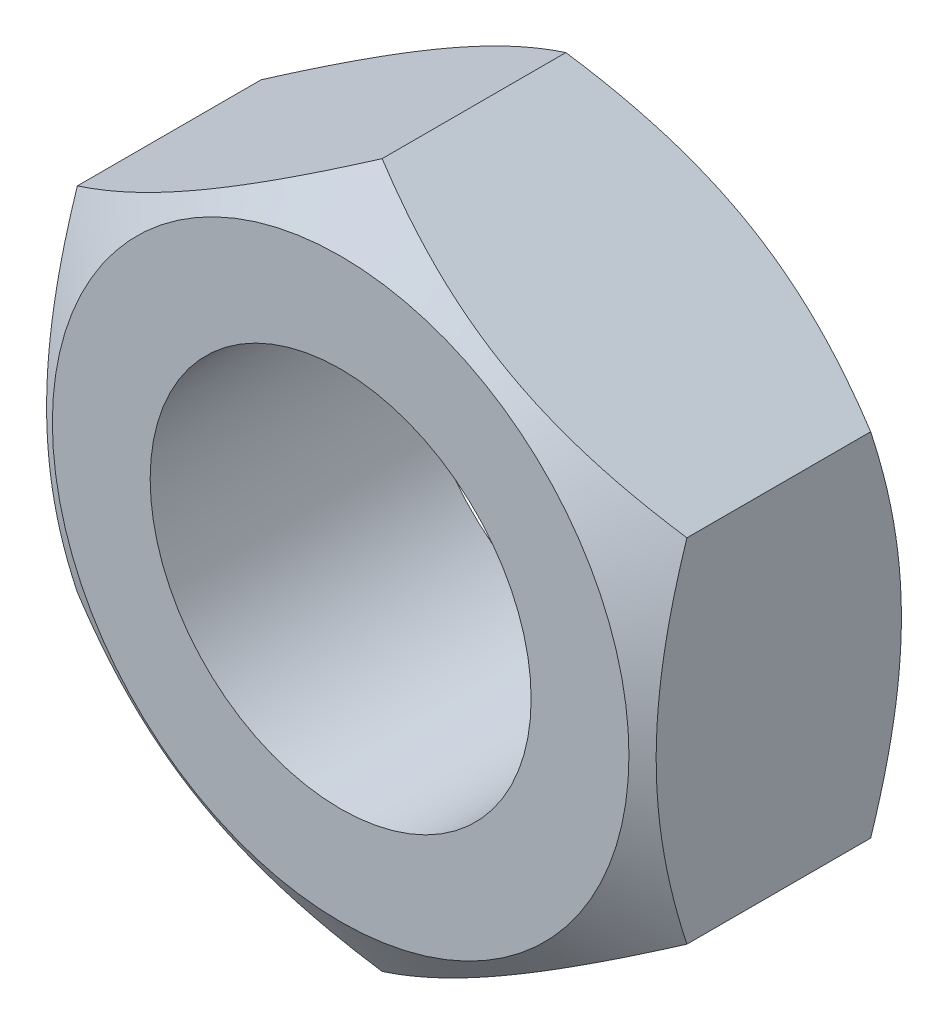
ISO-10303-21;
HEADER;
FILE_DESCRIPTION(('STEP AP214'),'2;1');
FILE_NAME('part.step','',(''),(''),'','','');
FILE_SCHEMA(('AUTOMOTIVE_DESIGN { 1 0 10303 214 1 1 1 1 }'));
ENDSEC;
DATA;
#1=APPLICATION_CONTEXT('core data for automotive mechanical design processes');
#2=APPLICATION_PROTOCOL_DEFINITION('international standard','automotive_design',2000,#1);
#3=PRODUCT_CONTEXT('',#1,'mechanical');
#4=PRODUCT('Part','Part','',(#3));
#5=PRODUCT_RELATED_PRODUCT_CATEGORY('part','',(#4));
#6=PRODUCT_DEFINITION_FORMATION('','',#4);
#7=PRODUCT_DEFINITION_CONTEXT('part definition',#1,'design');
#8=PRODUCT_DEFINITION('design','',#6,#7);
#9=PRODUCT_DEFINITION_SHAPE('','',#8);
#10=(LENGTH_UNIT() NAMED_UNIT(*) SI_UNIT(.MILLI.,.METRE.));
#11=(NAMED_UNIT(*) PLANE_ANGLE_UNIT() SI_UNIT($,.RADIAN.));
#12=(NAMED_UNIT(*) SI_UNIT($,.STERADIAN.) SOLID_ANGLE_UNIT());
#13=UNCERTAINTY_MEASURE_WITH_UNIT(LENGTH_MEASURE(1.E-05),#10,'distance_accuracy_value','');
#14=(GEOMETRIC_REPRESENTATION_CONTEXT(3) GLOBAL_UNCERTAINTY_ASSIGNED_CONTEXT((#13)) GLOBAL_UNIT_ASSIGNED_CONTEXT((#10,
#11,#12)) REPRESENTATION_CONTEXT('',''));
#15=CARTESIAN_POINT('',(0.,0.,0.));
#16=DIRECTION('',(0.,0.,1.));
#17=DIRECTION('',(1.,0.,0.));
#18=AXIS2_PLACEMENT_3D('',#15,#16,#17);
#19=CARTESIAN_POINT('',(3.2,1.8475208614068,2.8));
#20=DIRECTION('',(-0.5,-0.866025403784439,0.));
#21=DIRECTION('',(0.866025403784439,-0.5,0.));
#22=AXIS2_PLACEMENT_3D('',#19,#20,#21);
#23=PLANE('',#22);
#24=CARTESIAN_POINT('',(-0.000200000000000441,3.69515719286744,0.435457534457903));
#25=CARTESIAN_POINT('',(0.142056722683005,3.61302523573238,0.381930311846152));
#26=CARTESIAN_POINT('',(0.285877039933912,3.52999053685263,0.333174343011304));
#27=CARTESIAN_POINT('',(0.576723054863276,3.36207051184043,0.248146354782092));
#28=CARTESIAN_POINT('',(0.723757620535913,3.27718006576915,0.211915252029169));
#29=CARTESIAN_POINT('',(1.01550243813968,3.10874111679094,0.156159794503986));
#30=CARTESIAN_POINT('',(1.16013938966425,3.02523493389346,0.136143838803807));
#31=CARTESIAN_POINT('',(1.45021748741393,2.85775826607167,0.113079603160723));
#32=CARTESIAN_POINT('',(1.59565687621912,2.77378879579422,0.110002898259727));
#33=CARTESIAN_POINT('',(1.86325668847337,2.61928997215413,0.1202042187579));
#34=CARTESIAN_POINT('',(1.9854948081045,2.54871576087987,0.130995786499689));
#35=CARTESIAN_POINT('',(2.22894435962339,2.40816009677634,0.163964471122037));
#36=CARTESIAN_POINT('',(2.35015437912711,2.33817945938739,0.186155272422157));
#37=CARTESIAN_POINT('',(2.59418726023825,2.19728700978676,0.241166316862464));
#38=CARTESIAN_POINT('',(2.71696203456834,2.12640296077758,0.274263525622137));
#39=CARTESIAN_POINT('',(2.96023835427517,1.98594731210738,0.348954197018584));
#40=CARTESIAN_POINT('',(3.08074489710728,1.91637282716415,0.39052578391471));
#41=CARTESIAN_POINT('',(3.2002,1.84740539135297,0.435457534457901));
#42=B_SPLINE_CURVE_WITH_KNOTS('',3,(#24,#25,#26,#27,#28,#29,#30,#31,#32,#33,#34,#35,#36,#37,#38,
#39,#40,#41),.UNSPECIFIED.,.F.,.F.,(4,2,2,2,2,2,2,2,4),(0.,0.518586963357061,1.03885239920307,
1.54268298210446,2.04566785238501,2.46986049889256,2.89456356945576,3.3310108958864,
3.76634552951657),.UNSPECIFIED.);
#43=CARTESIAN_POINT('',(0.,3.6950417228136,0.43538229850192));
#44=VERTEX_POINT('',#43);
#45=CARTESIAN_POINT('',(3.2,1.8475208614068,0.435382298501921));
#46=VERTEX_POINT('',#45);
#47=EDGE_CURVE('E60',#44,#46,#42,.T.);
#48=ORIENTED_EDGE('',*,*,#47,.F.);
#49=DIRECTION('',(0.,0.,-1.));
#50=VECTOR('',#49,1.);
#51=CARTESIAN_POINT('',(0.,3.6950417228136,2.8));
#52=LINE('',#51,#50);
#53=CARTESIAN_POINT('',(0.,3.6950417228136,2.36461770149808));
#54=VERTEX_POINT('',#53);
#55=EDGE_CURVE('E53',#54,#44,#52,.T.);
#56=ORIENTED_EDGE('',*,*,#55,.F.);
#57=CARTESIAN_POINT('',(3.2002,1.84740539135297,2.3645424655421));
#58=CARTESIAN_POINT('',(3.05794327731699,1.92953734848803,2.41806968815385));
#59=CARTESIAN_POINT('',(2.91412296006609,2.01257204736778,2.4668256569887));
#60=CARTESIAN_POINT('',(2.62327694513672,2.18049207237998,2.55185364521791));
#61=CARTESIAN_POINT('',(2.47624237946409,2.26538251845126,2.58808474797083));
#62=CARTESIAN_POINT('',(2.18449756186032,2.43382146742947,2.64384020549601));
#63=CARTESIAN_POINT('',(2.03986061033575,2.51732765032695,2.66385616119619));
#64=CARTESIAN_POINT('',(1.74978251258607,2.68480431814874,2.68692039683928));
#65=CARTESIAN_POINT('',(1.60434312378088,2.76877378842619,2.68999710174027));
#66=CARTESIAN_POINT('',(1.33674331152662,2.92327261206628,2.6797957812421));
#67=CARTESIAN_POINT('',(1.2145051918955,2.99384682334054,2.66900421350031));
#68=CARTESIAN_POINT('',(0.971055640376603,3.13440248744407,2.63603552887796));
#69=CARTESIAN_POINT('',(0.84984562087289,3.20438312483302,2.61384472757784));
#70=CARTESIAN_POINT('',(0.605812739761751,3.34527557443365,2.55883368313754));
#71=CARTESIAN_POINT('',(0.48303796543166,3.41615962344283,2.52573647437786));
#72=CARTESIAN_POINT('',(0.239761645724824,3.55661527211303,2.45104580298142));
#73=CARTESIAN_POINT('',(0.119255102892721,3.62618975705626,2.40947421608529));
#74=CARTESIAN_POINT('',(-0.000200000000000088,3.69515719286744,2.3645424655421));
#75=B_SPLINE_CURVE_WITH_KNOTS('',3,(#57,#58,#59,#60,#61,#62,#63,#64,#65,#66,#67,#68,#69,#70,#71,
#72,#73,#74),.UNSPECIFIED.,.F.,.F.,(4,2,2,2,2,2,2,2,4),(0.,0.518586963357061,1.03885239920307,
1.54268298210446,2.04566785238501,2.46986049889256,2.89456356945576,3.3310108958864,
3.76634552951657),.UNSPECIFIED.);
#76=CARTESIAN_POINT('',(3.2,1.8475208614068,2.36461770149808));
#77=VERTEX_POINT('',#76);
#78=EDGE_CURVE('E132',#77,#54,#75,.T.);
#79=ORIENTED_EDGE('',*,*,#78,.F.);
#80=DIRECTION('',(0.,0.,-1.));
#81=VECTOR('',#80,1.);
#82=CARTESIAN_POINT('',(3.2,1.8475208614068,2.8));
#83=LINE('',#82,#81);
#84=EDGE_CURVE('E109',#77,#46,#83,.T.);
#85=ORIENTED_EDGE('',*,*,#84,.T.);
#86=EDGE_LOOP('',(#48,#56,#79,#85));
#87=FACE_BOUND('',#86,.T.);
#88=ADVANCED_FACE('F39',(#87),#23,.F.);
#89=CARTESIAN_POINT('',(0.,3.6950417228136,2.8));
#90=DIRECTION('',(0.5,-0.866025403784439,0.));
#91=DIRECTION('',(0.866025403784439,0.5,0.));
#92=AXIS2_PLACEMENT_3D('',#89,#90,#91);
#93=PLANE('',#92);
#94=CARTESIAN_POINT('',(-3.2002,1.84740539135296,0.435457534457904));
#95=CARTESIAN_POINT('',(-3.057943277317,1.92953734848803,0.381930311846153));
#96=CARTESIAN_POINT('',(-2.91412296006609,2.01257204736778,0.333174343011304));
#97=CARTESIAN_POINT('',(-2.62327694513673,2.18049207237998,0.248146354782092));
#98=CARTESIAN_POINT('',(-2.47624237946409,2.26538251845125,0.211915252029169));
#99=CARTESIAN_POINT('',(-2.18449756186032,2.43382146742947,0.156159794503986));
#100=CARTESIAN_POINT('',(-2.03986061033575,2.51732765032694,0.136143838803808));
#101=CARTESIAN_POINT('',(-1.74978251258607,2.68480431814874,0.113079603160723));
#102=CARTESIAN_POINT('',(-1.60434312378089,2.76877378842619,0.110002898259727));
#103=CARTESIAN_POINT('',(-1.33674331152663,2.92327261206627,0.1202042187579));
#104=CARTESIAN_POINT('',(-1.2145051918955,2.99384682334054,0.130995786499689));
#105=CARTESIAN_POINT('',(-0.971055640376605,3.13440248744407,0.163964471122037));
#106=CARTESIAN_POINT('',(-0.849845620872892,3.20438312483302,0.186155272422157));
#107=CARTESIAN_POINT('',(-0.605812739761752,3.34527557443365,0.241166316862464));
#108=CARTESIAN_POINT('',(-0.483037965431661,3.41615962344283,0.274263525622136));
#109=CARTESIAN_POINT('',(-0.239761645724824,3.55661527211303,0.348954197018584));
#110=CARTESIAN_POINT('',(-0.119255102892721,3.62618975705626,0.39052578391471));
#111=CARTESIAN_POINT('',(0.000199999999999801,3.69515719286744,0.435457534457901));
#112=B_SPLINE_CURVE_WITH_KNOTS('',3,(#94,#95,#96,#97,#98,#99,#100,#101,#102,#103,#104,#105,#106,
#107,#108,#109,#110,#111),.UNSPECIFIED.,.F.,.F.,(4,2,2,2,2,2,2,2,4),(0.,0.518586963357061,
1.03885239920307,1.54268298210446,2.04566785238501,2.46986049889256,2.89456356945576,
3.3310108958864,3.76634552951658),.UNSPECIFIED.);
#113=CARTESIAN_POINT('',(-3.2,1.8475208614068,0.43538229850192));
#114=VERTEX_POINT('',#113);
#115=EDGE_CURVE('E95',#114,#44,#112,.T.);
#116=ORIENTED_EDGE('',*,*,#115,.F.);
#117=DIRECTION('',(0.,0.,-1.));
#118=VECTOR('',#117,1.);
#119=CARTESIAN_POINT('',(-3.2,1.8475208614068,2.8));
#120=LINE('',#119,#118);
#121=CARTESIAN_POINT('',(-3.2,1.8475208614068,2.36461770149808));
#122=VERTEX_POINT('',#121);
#123=EDGE_CURVE('E115',#122,#114,#120,.T.);
#124=ORIENTED_EDGE('',*,*,#123,.F.);
#125=CARTESIAN_POINT('',(0.000199999999999613,3.69515719286744,2.3645424655421));
#126=CARTESIAN_POINT('',(-0.142056722683006,3.61302523573238,2.41806968815385));
#127=CARTESIAN_POINT('',(-0.285877039933913,3.52999053685263,2.4668256569887));
#128=CARTESIAN_POINT('',(-0.576723054863277,3.36207051184043,2.55185364521791));
#129=CARTESIAN_POINT('',(-0.723757620535914,3.27718006576915,2.58808474797083));
#130=CARTESIAN_POINT('',(-1.01550243813968,3.10874111679094,2.64384020549601));
#131=CARTESIAN_POINT('',(-1.16013938966425,3.02523493389346,2.66385616119619));
#132=CARTESIAN_POINT('',(-1.45021748741393,2.85775826607167,2.68692039683928));
#133=CARTESIAN_POINT('',(-1.59565687621912,2.77378879579422,2.68999710174027));
#134=CARTESIAN_POINT('',(-1.86325668847337,2.61928997215413,2.6797957812421));
#135=CARTESIAN_POINT('',(-1.9854948081045,2.54871576087987,2.66900421350031));
#136=CARTESIAN_POINT('',(-2.2289443596234,2.40816009677634,2.63603552887796));
#137=CARTESIAN_POINT('',(-2.35015437912711,2.33817945938739,2.61384472757784));
#138=CARTESIAN_POINT('',(-2.59418726023825,2.19728700978675,2.55883368313754));
#139=CARTESIAN_POINT('',(-2.71696203456834,2.12640296077758,2.52573647437786));
#140=CARTESIAN_POINT('',(-2.96023835427518,1.98594731210738,2.45104580298142));
#141=CARTESIAN_POINT('',(-3.08074489710728,1.91637282716415,2.40947421608529));
#142=CARTESIAN_POINT('',(-3.2002,1.84740539135296,2.3645424655421));
#143=B_SPLINE_CURVE_WITH_KNOTS('',3,(#125,#126,#127,#128,#129,#130,#131,#132,#133,#134,#135,
#136,#137,#138,#139,#140,#141,#142),.UNSPECIFIED.,.F.,.F.,(4,2,2,2,2,2,2,2,4),(0.,
0.518586963357061,1.03885239920307,1.54268298210446,2.04566785238501,2.46986049889256,
2.89456356945576,3.3310108958864,3.76634552951658),.UNSPECIFIED.);
#144=EDGE_CURVE('E114',#54,#122,#143,.T.);
#145=ORIENTED_EDGE('',*,*,#144,.F.);
#146=ORIENTED_EDGE('',*,*,#55,.T.);
#147=EDGE_LOOP('',(#116,#124,#145,#146));
#148=FACE_BOUND('',#147,.T.);
#149=ADVANCED_FACE('F113',(#148),#93,.F.);
#150=CARTESIAN_POINT('',(-3.2,1.8475208614068,2.8));
#151=DIRECTION('',(1.,0.,0.));
#152=DIRECTION('',(0.,1.,0.));
#153=AXIS2_PLACEMENT_3D('',#150,#151,#152);
#154=PLANE('',#153);
#155=CARTESIAN_POINT('',(-3.2,-4.64967608725636,1.70546514320698));
#156=CARTESIAN_POINT('',(-3.2,-4.52094609488479,1.63639337900852));
#157=CARTESIAN_POINT('',(-3.2,-4.39184192085894,1.56800678244437));
#158=CARTESIAN_POINT('',(-3.2,-4.13269723302857,1.43297357493133));
#159=CARTESIAN_POINT('',(-3.2,-4.00265654902984,1.36632729098244));
#160=CARTESIAN_POINT('',(-3.2,-3.74068874750626,1.23476361040895));
#161=CARTESIAN_POINT('',(-3.2,-3.60875493193839,1.16985950335667));
#162=CARTESIAN_POINT('',(-3.2,-3.34359594261194,1.04275429517871));
#163=CARTESIAN_POINT('',(-3.2,-3.21037083848579,0.980553049282839));
#164=CARTESIAN_POINT('',(-3.2,-2.93772025053588,0.857439400744566));
#165=CARTESIAN_POINT('',(-3.2,-2.79824025898896,0.796647039974788));
#166=CARTESIAN_POINT('',(-3.2,-2.51731459590784,0.679702985834002));
#167=CARTESIAN_POINT('',(-3.2,-2.37586868841213,0.623551855250586));
#168=CARTESIAN_POINT('',(-3.2,-2.09104942722341,0.517349312802273));
#169=CARTESIAN_POINT('',(-3.2,-1.94768120097718,0.467284290979125));
#170=CARTESIAN_POINT('',(-3.2,-1.65852226327635,0.374802320534358));
#171=CARTESIAN_POINT('',(-3.2,-1.51273239443081,0.332382770132313));
#172=CARTESIAN_POINT('',(-3.2,-1.20849757763453,0.254582441986828));
#173=CARTESIAN_POINT('',(-3.2,-1.04987302423019,0.219888416145775));
#174=CARTESIAN_POINT('',(-3.2,-0.730224493421796,0.16409302618807));
#175=CARTESIAN_POINT('',(-3.2,-0.569201079784077,0.142988518335139));
#176=CARTESIAN_POINT('',(-3.2,-0.248280060338895,0.116582934165847));
#177=CARTESIAN_POINT('',(-3.2,-0.0884023706787282,0.111047224722787));
#178=CARTESIAN_POINT('',(-3.2,0.231130233310361,0.115683158384926));
#179=CARTESIAN_POINT('',(-3.2,0.390785118550187,0.125856689688966));
#180=CARTESIAN_POINT('',(-3.2,0.746175580129736,0.165055432587596));
#181=CARTESIAN_POINT('',(-3.2,0.941474946168207,0.197984011454185));
#182=CARTESIAN_POINT('',(-3.2,1.32807223420297,0.282130600297792));
#183=CARTESIAN_POINT('',(-3.2,1.51936709466093,0.333362098887102));
#184=CARTESIAN_POINT('',(-3.2,1.90213423370217,0.45081131226141));
#185=CARTESIAN_POINT('',(-3.2,2.09350499425711,0.517352974414837));
#186=CARTESIAN_POINT('',(-3.2,2.37756007439295,0.624844038257259));
#187=CARTESIAN_POINT('',(-3.2,2.47173776152773,0.661950990111517));
#188=CARTESIAN_POINT('',(-3.2,2.65920377426769,0.738349556953992));
#189=CARTESIAN_POINT('',(-3.2,2.75249211190641,0.777641142333281));
#190=CARTESIAN_POINT('',(-3.2,2.98201154905297,0.877006350556005));
#191=CARTESIAN_POINT('',(-3.2,3.11777692536176,0.938153061595661));
#192=CARTESIAN_POINT('',(-3.2,3.38785108243732,1.06359235493341));
#193=CARTESIAN_POINT('',(-3.2,3.52215974829716,1.12788518322746));
#194=CARTESIAN_POINT('',(-3.2,3.7895845040724,1.25899068962019));
#195=CARTESIAN_POINT('',(-3.2,3.92270025029427,1.32580406675201));
#196=CARTESIAN_POINT('',(-3.2,4.18790107518493,1.46144925146426));
#197=CARTESIAN_POINT('',(-3.2,4.3199861241004,1.53028111704187));
#198=CARTESIAN_POINT('',(-3.2,4.71530642583745,1.73940681358127));
#199=CARTESIAN_POINT('',(-3.2,4.97724483067486,1.88215055875113));
#200=CARTESIAN_POINT('',(-3.2,5.49866071423871,2.17206210626084));
#201=CARTESIAN_POINT('',(-3.2,5.75813807006777,2.31923012802148));
#202=CARTESIAN_POINT('',(-3.2,6.25109865144145,2.60280077341931));
#203=CARTESIAN_POINT('',(-3.2,6.48474347591834,2.73892305764096));
#204=CARTESIAN_POINT('',(-3.2,6.95089750444523,3.01311981825846));
#205=CARTESIAN_POINT('',(-3.2,7.18340665473921,3.1511943858817));
#206=CARTESIAN_POINT('',(-3.2,7.64675193934581,3.42836990315065));
#207=CARTESIAN_POINT('',(-3.2,7.87759106970378,3.56746585154424));
#208=CARTESIAN_POINT('',(-3.2,8.33853687222873,3.84682860914649));
#209=CARTESIAN_POINT('',(-3.2,8.56864359703969,3.98709533145108));
#210=CARTESIAN_POINT('',(-3.2,8.79847887154545,4.1278019504984));
#211=B_SPLINE_CURVE_WITH_KNOTS('',3,(#155,#156,#157,#158,#159,#160,#161,#162,#163,#164,#165,
#166,#167,#168,#169,#170,#171,#172,#173,#174,#175,#176,#177,#178,#179,#180,#181,#182,#183,#184,
#185,#186,#187,#188,#189,#190,#191,#192,#193,#194,#195,#196,#197,#198,#199,#200,#201,#202,#203,
#204,#205,#206,#207,#208,#209,#210),.UNSPECIFIED.,.F.,.F.,(4,2,2,2,2,2,2,2,2,2,2,2,2,2,2,2,2,2,
2,2,2,2,2,2,2,2,2,4),(0.,0.438276847084768,0.876635461110845,1.31771337163469,1.75876762802552,
2.21515973022024,2.67160709279661,3.12701418532881,3.58226600742466,4.06889902255745,
4.55541942177514,5.03456726916205,5.51377271302049,6.10678753400877,6.70024029078813,
7.30764220144558,7.61129622325828,7.91494613056885,8.36159206979889,8.80827298840224,
9.25507871074557,9.70189728374568,10.5967471423651,11.4916414542746,12.302845819159,
13.1140882165604,13.922607413028,14.7310671192765),.UNSPECIFIED.);
#212=CARTESIAN_POINT('',(-3.2,-1.84752086140681,0.43538229850192));
#213=VERTEX_POINT('',#212);
#214=EDGE_CURVE('E98',#213,#114,#211,.T.);
#215=ORIENTED_EDGE('',*,*,#214,.F.);
#216=DIRECTION('',(0.,0.,-1.));
#217=VECTOR('',#216,1.);
#218=CARTESIAN_POINT('',(-3.2,-1.8475208614068,2.8));
#219=LINE('',#218,#217);
#220=CARTESIAN_POINT('',(-3.2,-1.84752086140681,2.36461770149808));
#221=VERTEX_POINT('',#220);
#222=EDGE_CURVE('E116',#221,#213,#219,.T.);
#223=ORIENTED_EDGE('',*,*,#222,.F.);
#224=CARTESIAN_POINT('',(-3.2,-4.64967608725636,1.09453485679302));
#225=CARTESIAN_POINT('',(-3.2,-4.52094609488479,1.16360662099148));
#226=CARTESIAN_POINT('',(-3.2,-4.39184192085894,1.23199321755563));
#227=CARTESIAN_POINT('',(-3.2,-4.13269723302857,1.36702642506867));
#228=CARTESIAN_POINT('',(-3.2,-4.00265654902984,1.43367270901756));
#229=CARTESIAN_POINT('',(-3.2,-3.74068874750626,1.56523638959106));
#230=CARTESIAN_POINT('',(-3.2,-3.60875493193839,1.63014049664333));
#231=CARTESIAN_POINT('',(-3.2,-3.34359594261194,1.75724570482129));
#232=CARTESIAN_POINT('',(-3.2,-3.21037083848579,1.81944695071716));
#233=CARTESIAN_POINT('',(-3.2,-2.93772025053588,1.94256059925543));
#234=CARTESIAN_POINT('',(-3.2,-2.79824025898895,2.00335296002521));
#235=CARTESIAN_POINT('',(-3.2,-2.51731459590784,2.120297014166));
#236=CARTESIAN_POINT('',(-3.2,-2.37586868841213,2.17644814474941));
#237=CARTESIAN_POINT('',(-3.2,-2.09104942722341,2.28265068719773));
#238=CARTESIAN_POINT('',(-3.2,-1.94768120097718,2.33271570902088));
#239=CARTESIAN_POINT('',(-3.2,-1.65852226327635,2.42519767946564));
#240=CARTESIAN_POINT('',(-3.2,-1.51273239443081,2.46761722986769));
#241=CARTESIAN_POINT('',(-3.2,-1.20849757763453,2.54541755801317));
#242=CARTESIAN_POINT('',(-3.2,-1.04987302423019,2.58011158385423));
#243=CARTESIAN_POINT('',(-3.2,-0.730224493421796,2.63590697381193));
#244=CARTESIAN_POINT('',(-3.2,-0.569201079784077,2.65701148166486));
#245=CARTESIAN_POINT('',(-3.2,-0.248280060338896,2.68341706583415));
#246=CARTESIAN_POINT('',(-3.2,-0.0884023706787287,2.68895277527721));
#247=CARTESIAN_POINT('',(-3.2,0.23113023331036,2.68431684161507));
#248=CARTESIAN_POINT('',(-3.2,0.390785118550187,2.67414331031103));
#249=CARTESIAN_POINT('',(-3.2,0.746175580129736,2.6349445674124));
#250=CARTESIAN_POINT('',(-3.2,0.941474946168207,2.60201598854582));
#251=CARTESIAN_POINT('',(-3.2,1.32807223420297,2.51786939970221));
#252=CARTESIAN_POINT('',(-3.2,1.51936709466093,2.4666379011129));
#253=CARTESIAN_POINT('',(-3.2,1.90213423370217,2.34918868773859));
#254=CARTESIAN_POINT('',(-3.2,2.09350499425711,2.28264702558516));
#255=CARTESIAN_POINT('',(-3.2,2.37756007439295,2.17515596174274));
#256=CARTESIAN_POINT('',(-3.2,2.47173776152772,2.13804900988848));
#257=CARTESIAN_POINT('',(-3.2,2.65920377426769,2.06165044304601));
#258=CARTESIAN_POINT('',(-3.2,2.75249211190641,2.02235885766672));
#259=CARTESIAN_POINT('',(-3.2,2.98201154905297,1.922993649444));
#260=CARTESIAN_POINT('',(-3.2,3.11777692536176,1.86184693840434));
#261=CARTESIAN_POINT('',(-3.2,3.38785108243732,1.73640764506659));
#262=CARTESIAN_POINT('',(-3.2,3.52215974829716,1.67211481677254));
#263=CARTESIAN_POINT('',(-3.2,3.7895845040724,1.54100931037981));
#264=CARTESIAN_POINT('',(-3.2,3.92270025029427,1.47419593324799));
#265=CARTESIAN_POINT('',(-3.2,4.18790107518493,1.33855074853574));
#266=CARTESIAN_POINT('',(-3.2,4.3199861241004,1.26971888295813));
#267=CARTESIAN_POINT('',(-3.2,4.71530642583745,1.06059318641873));
#268=CARTESIAN_POINT('',(-3.2,4.97724483067486,0.917849441248866));
#269=CARTESIAN_POINT('',(-3.2,5.49866071423871,0.627937893739163));
#270=CARTESIAN_POINT('',(-3.2,5.75813807006776,0.480769871978518));
#271=CARTESIAN_POINT('',(-3.2,6.25109865144145,0.197199226580695));
#272=CARTESIAN_POINT('',(-3.2,6.48474347591834,0.0610769423590396));
#273=CARTESIAN_POINT('',(-3.2,6.95089750444523,-0.213119818258459));
#274=CARTESIAN_POINT('',(-3.2,7.1834066547392,-0.351194385881695));
#275=CARTESIAN_POINT('',(-3.2,7.64675193934581,-0.628369903150652));
#276=CARTESIAN_POINT('',(-3.2,7.87759106970378,-0.767465851544235));
#277=CARTESIAN_POINT('',(-3.2,8.33853687222873,-1.04682860914649));
#278=CARTESIAN_POINT('',(-3.2,8.56864359703969,-1.18709533145108));
#279=CARTESIAN_POINT('',(-3.2,8.79847887154545,-1.3278019504984));
#280=B_SPLINE_CURVE_WITH_KNOTS('',3,(#224,#225,#226,#227,#228,#229,#230,#231,#232,#233,#234,
#235,#236,#237,#238,#239,#240,#241,#242,#243,#244,#245,#246,#247,#248,#249,#250,#251,#252,#253,
#254,#255,#256,#257,#258,#259,#260,#261,#262,#263,#264,#265,#266,#267,#268,#269,#270,#271,#272,
#273,#274,#275,#276,#277,#278,#279),.UNSPECIFIED.,.F.,.F.,(4,2,2,2,2,2,2,2,2,2,2,2,2,2,2,2,2,2,
2,2,2,2,2,2,2,2,2,4),(0.,0.438276847084768,0.876635461110844,1.31771337163469,1.75876762802552,
2.21515973022024,2.67160709279661,3.12701418532881,3.58226600742466,4.06889902255745,
4.55541942177514,5.03456726916205,5.51377271302049,6.10678753400877,6.70024029078813,
7.30764220144558,7.61129622325828,7.91494613056885,8.36159206979889,8.80827298840224,
9.25507871074557,9.70189728374567,10.5967471423651,11.4916414542746,12.3028458191589,
13.1140882165604,13.922607413028,14.7310671192765),.UNSPECIFIED.);
#281=EDGE_CURVE('E173',#122,#221,#280,.F.);
#282=ORIENTED_EDGE('',*,*,#281,.F.);
#283=ORIENTED_EDGE('',*,*,#123,.T.);
#284=EDGE_LOOP('',(#215,#223,#282,#283));
#285=FACE_BOUND('',#284,.T.);
#286=ADVANCED_FACE('F179',(#285),#154,.F.);
#287=CARTESIAN_POINT('',(-3.2,-1.8475208614068,2.8));
#288=DIRECTION('',(0.5,0.866025403784439,0.));
#289=DIRECTION('',(-0.866025403784439,0.5,0.));
#290=AXIS2_PLACEMENT_3D('',#287,#288,#289);
#291=PLANE('',#290);
#292=CARTESIAN_POINT('',(0.000199999999999858,-3.69515719286744,0.435457534457903));
#293=CARTESIAN_POINT('',(-0.142056722683006,-3.61302523573238,0.381930311846153));
#294=CARTESIAN_POINT('',(-0.285877039933913,-3.52999053685263,0.333174343011304));
#295=CARTESIAN_POINT('',(-0.576723054863277,-3.36207051184043,0.248146354782093));
#296=CARTESIAN_POINT('',(-0.723757620535914,-3.27718006576915,0.211915252029169));
#297=CARTESIAN_POINT('',(-1.01550243813968,-3.10874111679094,0.156159794503986));
#298=CARTESIAN_POINT('',(-1.16013938966425,-3.02523493389346,0.136143838803808));
#299=CARTESIAN_POINT('',(-1.45021748741393,-2.85775826607167,0.113079603160724));
#300=CARTESIAN_POINT('',(-1.59565687621912,-2.77378879579422,0.110002898259727));
#301=CARTESIAN_POINT('',(-1.86325668847337,-2.61928997215413,0.120204218757901));
#302=CARTESIAN_POINT('',(-1.9854948081045,-2.54871576087987,0.13099578649969));
#303=CARTESIAN_POINT('',(-2.2289443596234,-2.40816009677634,0.163964471122038));
#304=CARTESIAN_POINT('',(-2.35015437912711,-2.33817945938739,0.186155272422157));
#305=CARTESIAN_POINT('',(-2.59418726023825,-2.19728700978676,0.241166316862464));
#306=CARTESIAN_POINT('',(-2.71696203456834,-2.12640296077758,0.274263525622137));
#307=CARTESIAN_POINT('',(-2.96023835427518,-1.98594731210738,0.348954197018585));
#308=CARTESIAN_POINT('',(-3.08074489710728,-1.91637282716415,0.39052578391471));
#309=CARTESIAN_POINT('',(-3.2002,-1.84740539135297,0.435457534457901));
#310=B_SPLINE_CURVE_WITH_KNOTS('',3,(#292,#293,#294,#295,#296,#297,#298,#299,#300,#301,#302,
#303,#304,#305,#306,#307,#308,#309),.UNSPECIFIED.,.F.,.F.,(4,2,2,2,2,2,2,2,4),(0.,
0.51858696335706,1.03885239920307,1.54268298210446,2.04566785238501,2.46986049889256,
2.89456356945576,3.3310108958864,3.76634552951657),.UNSPECIFIED.);
#311=CARTESIAN_POINT('',(0.,-3.6950417228136,0.43538229850192));
#312=VERTEX_POINT('',#311);
#313=EDGE_CURVE('E193',#312,#213,#310,.T.);
#314=ORIENTED_EDGE('',*,*,#313,.F.);
#315=DIRECTION('',(0.,0.,-1.));
#316=VECTOR('',#315,1.);
#317=CARTESIAN_POINT('',(0.,-3.69504172281361,2.8));
#318=LINE('',#317,#316);
#319=CARTESIAN_POINT('',(0.,-3.6950417228136,2.36461770149808));
#320=VERTEX_POINT('',#319);
#321=EDGE_CURVE('E121',#320,#312,#318,.T.);
#322=ORIENTED_EDGE('',*,*,#321,.F.);
#323=CARTESIAN_POINT('',(-3.2002,-1.84740539135297,2.3645424655421));
#324=CARTESIAN_POINT('',(-3.05794327731699,-1.92953734848803,2.41806968815385));
#325=CARTESIAN_POINT('',(-2.91412296006609,-2.01257204736778,2.4668256569887));
#326=CARTESIAN_POINT('',(-2.62327694513672,-2.18049207237998,2.55185364521791));
#327=CARTESIAN_POINT('',(-2.47624237946409,-2.26538251845126,2.58808474797083));
#328=CARTESIAN_POINT('',(-2.18449756186032,-2.43382146742947,2.64384020549601));
#329=CARTESIAN_POINT('',(-2.03986061033575,-2.51732765032695,2.66385616119619));
#330=CARTESIAN_POINT('',(-1.74978251258607,-2.68480431814874,2.68692039683928));
#331=CARTESIAN_POINT('',(-1.60434312378088,-2.76877378842619,2.68999710174027));
#332=CARTESIAN_POINT('',(-1.33674331152663,-2.92327261206628,2.6797957812421));
#333=CARTESIAN_POINT('',(-1.2145051918955,-2.99384682334054,2.66900421350031));
#334=CARTESIAN_POINT('',(-0.971055640376604,-3.13440248744407,2.63603552887796));
#335=CARTESIAN_POINT('',(-0.849845620872891,-3.20438312483302,2.61384472757784));
#336=CARTESIAN_POINT('',(-0.605812739761752,-3.34527557443365,2.55883368313754));
#337=CARTESIAN_POINT('',(-0.483037965431661,-3.41615962344283,2.52573647437786));
#338=CARTESIAN_POINT('',(-0.239761645724824,-3.55661527211303,2.45104580298142));
#339=CARTESIAN_POINT('',(-0.119255102892722,-3.62618975705626,2.40947421608529));
#340=CARTESIAN_POINT('',(0.000199999999999549,-3.69515719286744,2.3645424655421));
#341=B_SPLINE_CURVE_WITH_KNOTS('',3,(#323,#324,#325,#326,#327,#328,#329,#330,#331,#332,#333,
#334,#335,#336,#337,#338,#339,#340),.UNSPECIFIED.,.F.,.F.,(4,2,2,2,2,2,2,2,4),(0.,
0.518586963357061,1.03885239920307,1.54268298210446,2.04566785238501,2.46986049889256,
2.89456356945576,3.3310108958864,3.76634552951657),.UNSPECIFIED.);
#342=EDGE_CURVE('E167',#221,#320,#341,.T.);
#343=ORIENTED_EDGE('',*,*,#342,.F.);
#344=ORIENTED_EDGE('',*,*,#222,.T.);
#345=EDGE_LOOP('',(#314,#322,#343,#344));
#346=FACE_BOUND('',#345,.T.);
#347=ADVANCED_FACE('F182',(#346),#291,.F.);
#348=CARTESIAN_POINT('',(0.,-3.69504172281361,2.8));
#349=DIRECTION('',(-0.5,0.866025403784439,0.));
#350=DIRECTION('',(-0.866025403784439,-0.5,0.));
#351=AXIS2_PLACEMENT_3D('',#348,#349,#350);
#352=PLANE('',#351);
#353=CARTESIAN_POINT('',(3.2002,-1.84740539135297,0.435457534457904));
#354=CARTESIAN_POINT('',(3.05794327731699,-1.92953734848803,0.381930311846153));
#355=CARTESIAN_POINT('',(2.91412296006609,-2.01257204736778,0.333174343011304));
#356=CARTESIAN_POINT('',(2.62327694513672,-2.18049207237998,0.248146354782093));
#357=CARTESIAN_POINT('',(2.47624237946409,-2.26538251845126,0.211915252029169));
#358=CARTESIAN_POINT('',(2.18449756186032,-2.43382146742947,0.156159794503986));
#359=CARTESIAN_POINT('',(2.03986061033575,-2.51732765032694,0.136143838803808));
#360=CARTESIAN_POINT('',(1.74978251258607,-2.68480431814874,0.113079603160723));
#361=CARTESIAN_POINT('',(1.60434312378088,-2.76877378842619,0.110002898259727));
#362=CARTESIAN_POINT('',(1.33674331152663,-2.92327261206628,0.1202042187579));
#363=CARTESIAN_POINT('',(1.2145051918955,-2.99384682334054,0.130995786499689));
#364=CARTESIAN_POINT('',(0.971055640376605,-3.13440248744407,0.163964471122037));
#365=CARTESIAN_POINT('',(0.849845620872892,-3.20438312483302,0.186155272422157));
#366=CARTESIAN_POINT('',(0.605812739761752,-3.34527557443365,0.241166316862465));
#367=CARTESIAN_POINT('',(0.483037965431661,-3.41615962344283,0.274263525622137));
#368=CARTESIAN_POINT('',(0.239761645724823,-3.55661527211303,0.348954197018584));
#369=CARTESIAN_POINT('',(0.119255102892721,-3.62618975705626,0.39052578391471));
#370=CARTESIAN_POINT('',(-0.000200000000000391,-3.69515719286744,0.435457534457902));
#371=B_SPLINE_CURVE_WITH_KNOTS('',3,(#353,#354,#355,#356,#357,#358,#359,#360,#361,#362,#363,
#364,#365,#366,#367,#368,#369,#370),.UNSPECIFIED.,.F.,.F.,(4,2,2,2,2,2,2,2,4),(0.,
0.51858696335706,1.03885239920307,1.54268298210446,2.04566785238501,2.46986049889256,
2.89456356945576,3.3310108958864,3.76634552951658),.UNSPECIFIED.);
#372=CARTESIAN_POINT('',(3.2,-1.8475208614068,0.43538229850192));
#373=VERTEX_POINT('',#372);
#374=EDGE_CURVE('E220',#373,#312,#371,.T.);
#375=ORIENTED_EDGE('',*,*,#374,.F.);
#376=DIRECTION('',(0.,0.,-1.));
#377=VECTOR('',#376,1.);
#378=CARTESIAN_POINT('',(3.2,-1.8475208614068,2.8));
#379=LINE('',#378,#377);
#380=CARTESIAN_POINT('',(3.2,-1.8475208614068,2.36461770149808));
#381=VERTEX_POINT('',#380);
#382=EDGE_CURVE('E124',#381,#373,#379,.T.);
#383=ORIENTED_EDGE('',*,*,#382,.F.);
#384=CARTESIAN_POINT('',(-0.000200000000000163,-3.69515719286744,2.3645424655421));
#385=CARTESIAN_POINT('',(0.142056722683005,-3.61302523573238,2.41806968815385));
#386=CARTESIAN_POINT('',(0.285877039933913,-3.52999053685263,2.4668256569887));
#387=CARTESIAN_POINT('',(0.576723054863276,-3.36207051184043,2.55185364521791));
#388=CARTESIAN_POINT('',(0.723757620535913,-3.27718006576915,2.58808474797083));
#389=CARTESIAN_POINT('',(1.01550243813968,-3.10874111679094,2.64384020549601));
#390=CARTESIAN_POINT('',(1.16013938966425,-3.02523493389346,2.66385616119619));
#391=CARTESIAN_POINT('',(1.45021748741393,-2.85775826607167,2.68692039683928));
#392=CARTESIAN_POINT('',(1.59565687621912,-2.77378879579422,2.68999710174027));
#393=CARTESIAN_POINT('',(1.86325668847337,-2.61928997215413,2.6797957812421));
#394=CARTESIAN_POINT('',(1.9854948081045,-2.54871576087987,2.66900421350031));
#395=CARTESIAN_POINT('',(2.2289443596234,-2.40816009677634,2.63603552887796));
#396=CARTESIAN_POINT('',(2.35015437912711,-2.33817945938739,2.61384472757784));
#397=CARTESIAN_POINT('',(2.59418726023825,-2.19728700978676,2.55883368313754));
#398=CARTESIAN_POINT('',(2.71696203456834,-2.12640296077758,2.52573647437786));
#399=CARTESIAN_POINT('',(2.96023835427518,-1.98594731210738,2.45104580298142));
#400=CARTESIAN_POINT('',(3.08074489710728,-1.91637282716415,2.40947421608529));
#401=CARTESIAN_POINT('',(3.2002,-1.84740539135297,2.3645424655421));
#402=B_SPLINE_CURVE_WITH_KNOTS('',3,(#384,#385,#386,#387,#388,#389,#390,#391,#392,#393,#394,
#395,#396,#397,#398,#399,#400,#401),.UNSPECIFIED.,.F.,.F.,(4,2,2,2,2,2,2,2,4),(0.,
0.518586963357061,1.03885239920307,1.54268298210446,2.04566785238501,2.46986049889256,
2.89456356945576,3.3310108958864,3.76634552951658),.UNSPECIFIED.);
#403=EDGE_CURVE('E67',#320,#381,#402,.T.);
#404=ORIENTED_EDGE('',*,*,#403,.F.);
#405=ORIENTED_EDGE('',*,*,#321,.T.);
#406=EDGE_LOOP('',(#375,#383,#404,#405));
#407=FACE_BOUND('',#406,.T.);
#408=ADVANCED_FACE('F218',(#407),#352,.F.);
#409=CARTESIAN_POINT('',(3.2,-1.8475208614068,2.8));
#410=DIRECTION('',(-1.,0.,0.));
#411=DIRECTION('',(0.,-1.,0.));
#412=AXIS2_PLACEMENT_3D('',#409,#410,#411);
#413=PLANE('',#412);
#414=CARTESIAN_POINT('',(3.2,-4.64967608725636,1.70546514320699));
#415=CARTESIAN_POINT('',(3.2,-4.52094609488479,1.63639337900852));
#416=CARTESIAN_POINT('',(3.2,-4.39184192085894,1.56800678244437));
#417=CARTESIAN_POINT('',(3.2,-4.13269723302857,1.43297357493133));
#418=CARTESIAN_POINT('',(3.2,-4.00265654902984,1.36632729098244));
#419=CARTESIAN_POINT('',(3.2,-3.74068874750626,1.23476361040895));
#420=CARTESIAN_POINT('',(3.2,-3.60875493193839,1.16985950335667));
#421=CARTESIAN_POINT('',(3.2,-3.34359594261194,1.04275429517871));
#422=CARTESIAN_POINT('',(3.2,-3.21037083848578,0.980553049282839));
#423=CARTESIAN_POINT('',(3.2,-2.93772025053587,0.857439400744565));
#424=CARTESIAN_POINT('',(3.2,-2.79824025898895,0.796647039974787));
#425=CARTESIAN_POINT('',(3.2,-2.51731459590783,0.679702985834002));
#426=CARTESIAN_POINT('',(3.2,-2.37586868841213,0.623551855250585));
#427=CARTESIAN_POINT('',(3.2,-2.0910494272234,0.517349312802272));
#428=CARTESIAN_POINT('',(3.2,-1.94768120097718,0.467284290979124));
#429=CARTESIAN_POINT('',(3.2,-1.65852226327635,0.374802320534357));
#430=CARTESIAN_POINT('',(3.2,-1.51273239443081,0.332382770132312));
#431=CARTESIAN_POINT('',(3.2,-1.20849757763452,0.254582441986827));
#432=CARTESIAN_POINT('',(3.2,-1.04987302423018,0.219888416145775));
#433=CARTESIAN_POINT('',(3.2,-0.730224493421794,0.164093026188069));
#434=CARTESIAN_POINT('',(3.2,-0.569201079784075,0.142988518335139));
#435=CARTESIAN_POINT('',(3.2,-0.248280060338894,0.116582934165847));
#436=CARTESIAN_POINT('',(3.2,-0.0884023706787271,0.111047224722786));
#437=CARTESIAN_POINT('',(3.2,0.231130233310362,0.115683158384925));
#438=CARTESIAN_POINT('',(3.2,0.390785118550188,0.125856689688965));
#439=CARTESIAN_POINT('',(3.2,0.746175580129738,0.165055432587596));
#440=CARTESIAN_POINT('',(3.2,0.941474946168209,0.197984011454184));
#441=CARTESIAN_POINT('',(3.2,1.32807223420297,0.282130600297791));
#442=CARTESIAN_POINT('',(3.2,1.51936709466093,0.333362098887101));
#443=CARTESIAN_POINT('',(3.2,1.90213423370218,0.450811312261409));
#444=CARTESIAN_POINT('',(3.2,2.09350499425711,0.517352974414837));
#445=CARTESIAN_POINT('',(3.2,2.37756007439295,0.624844038257258));
#446=CARTESIAN_POINT('',(3.2,2.47173776152773,0.661950990111517));
#447=CARTESIAN_POINT('',(3.2,2.65920377426769,0.738349556953991));
#448=CARTESIAN_POINT('',(3.2,2.75249211190641,0.77764114233328));
#449=CARTESIAN_POINT('',(3.2,2.98201154905297,0.877006350556003));
#450=CARTESIAN_POINT('',(3.2,3.11777692536176,0.93815306159566));
#451=CARTESIAN_POINT('',(3.2,3.38785108243732,1.0635923549334));
#452=CARTESIAN_POINT('',(3.2,3.52215974829716,1.12788518322746));
#453=CARTESIAN_POINT('',(3.2,3.7895845040724,1.25899068962019));
#454=CARTESIAN_POINT('',(3.2,3.92270025029427,1.325804066752));
#455=CARTESIAN_POINT('',(3.2,4.18790107518493,1.46144925146426));
#456=CARTESIAN_POINT('',(3.2,4.3199861241004,1.53028111704187));
#457=CARTESIAN_POINT('',(3.2,4.71530642583745,1.73940681358127));
#458=CARTESIAN_POINT('',(3.2,4.97724483067487,1.88215055875113));
#459=CARTESIAN_POINT('',(3.2,5.49866071423871,2.17206210626084));
#460=CARTESIAN_POINT('',(3.2,5.75813807006777,2.31923012802148));
#461=CARTESIAN_POINT('',(3.2,6.25109865144145,2.60280077341931));
#462=CARTESIAN_POINT('',(3.2,6.48474347591834,2.73892305764096));
#463=CARTESIAN_POINT('',(3.2,6.95089750444523,3.01311981825846));
#464=CARTESIAN_POINT('',(3.2,7.18340665473921,3.1511943858817));
#465=CARTESIAN_POINT('',(3.2,7.64675193934581,3.42836990315065));
#466=CARTESIAN_POINT('',(3.2,7.87759106970378,3.56746585154424));
#467=CARTESIAN_POINT('',(3.2,8.33853687222874,3.84682860914649));
#468=CARTESIAN_POINT('',(3.2,8.56864359703969,3.98709533145108));
#469=CARTESIAN_POINT('',(3.2,8.79847887154546,4.1278019504984));
#470=B_SPLINE_CURVE_WITH_KNOTS('',3,(#414,#415,#416,#417,#418,#419,#420,#421,#422,#423,#424,
#425,#426,#427,#428,#429,#430,#431,#432,#433,#434,#435,#436,#437,#438,#439,#440,#441,#442,#443,
#444,#445,#446,#447,#448,#449,#450,#451,#452,#453,#454,#455,#456,#457,#458,#459,#460,#461,#462,
#463,#464,#465,#466,#467,#468,#469),.UNSPECIFIED.,.F.,.F.,(4,2,2,2,2,2,2,2,2,2,2,2,2,2,2,2,2,2,
2,2,2,2,2,2,2,2,2,4),(0.,0.438276847084769,0.876635461110847,1.31771337163469,1.75876762802552,
2.21515973022024,2.67160709279661,3.12701418532882,3.58226600742466,4.06889902255746,
4.55541942177514,5.03456726916205,5.51377271302049,6.10678753400877,6.70024029078813,
7.30764220144559,7.61129622325828,7.91494613056885,8.36159206979889,8.80827298840224,
9.25507871074557,9.70189728374568,10.5967471423651,11.4916414542746,12.302845819159,
13.1140882165604,13.922607413028,14.7310671192766),.UNSPECIFIED.);
#471=EDGE_CURVE('E221',#46,#373,#470,.F.);
#472=ORIENTED_EDGE('',*,*,#471,.F.);
#473=ORIENTED_EDGE('',*,*,#84,.F.);
#474=CARTESIAN_POINT('',(3.2,-4.64967608725636,1.09453485679301));
#475=CARTESIAN_POINT('',(3.2,-4.52094609488479,1.16360662099148));
#476=CARTESIAN_POINT('',(3.2,-4.39184192085894,1.23199321755563));
#477=CARTESIAN_POINT('',(3.2,-4.13269723302857,1.36702642506867));
#478=CARTESIAN_POINT('',(3.2,-4.00265654902984,1.43367270901756));
#479=CARTESIAN_POINT('',(3.2,-3.74068874750626,1.56523638959105));
#480=CARTESIAN_POINT('',(3.2,-3.60875493193839,1.63014049664333));
#481=CARTESIAN_POINT('',(3.2,-3.34359594261194,1.75724570482129));
#482=CARTESIAN_POINT('',(3.2,-3.21037083848578,1.81944695071716));
#483=CARTESIAN_POINT('',(3.2,-2.93772025053587,1.94256059925543));
#484=CARTESIAN_POINT('',(3.2,-2.79824025898895,2.00335296002521));
#485=CARTESIAN_POINT('',(3.2,-2.51731459590783,2.120297014166));
#486=CARTESIAN_POINT('',(3.2,-2.37586868841213,2.17644814474941));
#487=CARTESIAN_POINT('',(3.2,-2.0910494272234,2.28265068719773));
#488=CARTESIAN_POINT('',(3.2,-1.94768120097718,2.33271570902088));
#489=CARTESIAN_POINT('',(3.2,-1.65852226327635,2.42519767946564));
#490=CARTESIAN_POINT('',(3.2,-1.51273239443081,2.46761722986769));
#491=CARTESIAN_POINT('',(3.2,-1.20849757763452,2.54541755801317));
#492=CARTESIAN_POINT('',(3.2,-1.04987302423018,2.58011158385423));
#493=CARTESIAN_POINT('',(3.2,-0.730224493421794,2.63590697381193));
#494=CARTESIAN_POINT('',(3.2,-0.569201079784075,2.65701148166486));
#495=CARTESIAN_POINT('',(3.2,-0.248280060338894,2.68341706583415));
#496=CARTESIAN_POINT('',(3.2,-0.0884023706787273,2.68895277527721));
#497=CARTESIAN_POINT('',(3.2,0.231130233310361,2.68431684161507));
#498=CARTESIAN_POINT('',(3.2,0.390785118550188,2.67414331031103));
#499=CARTESIAN_POINT('',(3.2,0.746175580129737,2.6349445674124));
#500=CARTESIAN_POINT('',(3.2,0.941474946168208,2.60201598854582));
#501=CARTESIAN_POINT('',(3.2,1.32807223420297,2.51786939970221));
#502=CARTESIAN_POINT('',(3.2,1.51936709466093,2.4666379011129));
#503=CARTESIAN_POINT('',(3.2,1.90213423370217,2.34918868773859));
#504=CARTESIAN_POINT('',(3.2,2.09350499425711,2.28264702558516));
#505=CARTESIAN_POINT('',(3.2,2.37756007439295,2.17515596174274));
#506=CARTESIAN_POINT('',(3.2,2.47173776152773,2.13804900988848));
#507=CARTESIAN_POINT('',(3.2,2.65920377426769,2.06165044304601));
#508=CARTESIAN_POINT('',(3.2,2.75249211190641,2.02235885766672));
#509=CARTESIAN_POINT('',(3.2,2.98201154905297,1.922993649444));
#510=CARTESIAN_POINT('',(3.2,3.11777692536176,1.86184693840434));
#511=CARTESIAN_POINT('',(3.2,3.38785108243733,1.7364076450666));
#512=CARTESIAN_POINT('',(3.2,3.52215974829716,1.67211481677254));
#513=CARTESIAN_POINT('',(3.2,3.7895845040724,1.54100931037981));
#514=CARTESIAN_POINT('',(3.2,3.92270025029427,1.474195933248));
#515=CARTESIAN_POINT('',(3.2,4.18790107518493,1.33855074853574));
#516=CARTESIAN_POINT('',(3.2,4.3199861241004,1.26971888295813));
#517=CARTESIAN_POINT('',(3.2,4.71530642583745,1.06059318641873));
#518=CARTESIAN_POINT('',(3.2,4.97724483067486,0.917849441248867));
#519=CARTESIAN_POINT('',(3.2,5.49866071423871,0.627937893739164));
#520=CARTESIAN_POINT('',(3.2,5.75813807006777,0.480769871978518));
#521=CARTESIAN_POINT('',(3.2,6.25109865144145,0.197199226580695));
#522=CARTESIAN_POINT('',(3.2,6.48474347591834,0.061076942359039));
#523=CARTESIAN_POINT('',(3.2,6.95089750444523,-0.21311981825846));
#524=CARTESIAN_POINT('',(3.2,7.18340665473921,-0.351194385881696));
#525=CARTESIAN_POINT('',(3.2,7.64675193934581,-0.628369903150653));
#526=CARTESIAN_POINT('',(3.2,7.87759106970378,-0.767465851544235));
#527=CARTESIAN_POINT('',(3.2,8.33853687222873,-1.04682860914649));
#528=CARTESIAN_POINT('',(3.2,8.56864359703969,-1.18709533145108));
#529=CARTESIAN_POINT('',(3.2,8.79847887154545,-1.3278019504984));
#530=B_SPLINE_CURVE_WITH_KNOTS('',3,(#474,#475,#476,#477,#478,#479,#480,#481,#482,#483,#484,
#485,#486,#487,#488,#489,#490,#491,#492,#493,#494,#495,#496,#497,#498,#499,#500,#501,#502,#503,
#504,#505,#506,#507,#508,#509,#510,#511,#512,#513,#514,#515,#516,#517,#518,#519,#520,#521,#522,
#523,#524,#525,#526,#527,#528,#529),.UNSPECIFIED.,.F.,.F.,(4,2,2,2,2,2,2,2,2,2,2,2,2,2,2,2,2,2,
2,2,2,2,2,2,2,2,2,4),(0.,0.438276847084769,0.876635461110845,1.31771337163469,1.75876762802552,
2.21515973022024,2.67160709279661,3.12701418532882,3.58226600742466,4.06889902255746,
4.55541942177514,5.03456726916205,5.51377271302049,6.10678753400877,6.70024029078813,
7.30764220144558,7.61129622325828,7.91494613056885,8.3615920697989,8.80827298840224,
9.25507871074557,9.70189728374568,10.5967471423651,11.4916414542746,12.302845819159,
13.1140882165604,13.922607413028,14.7310671192766),.UNSPECIFIED.);
#531=EDGE_CURVE('E11',#381,#77,#530,.T.);
#532=ORIENTED_EDGE('',*,*,#531,.F.);
#533=ORIENTED_EDGE('',*,*,#382,.T.);
#534=EDGE_LOOP('',(#472,#473,#532,#533));
#535=FACE_BOUND('',#534,.T.);
#536=ADVANCED_FACE('F235',(#535),#413,.F.);
#537=CARTESIAN_POINT('',(0.,0.,0.));
#538=DIRECTION('',(0.,0.,1.));
#539=DIRECTION('',(1.,0.,0.));
#540=AXIS2_PLACEMENT_3D('',#537,#538,#539);
#541=PLANE('',#540);
#542=CARTESIAN_POINT('',(0.,0.,0.));
#543=DIRECTION('',(0.,0.,1.));
#544=DIRECTION('',(1.,0.,0.));
#545=AXIS2_PLACEMENT_3D('',#542,#543,#544);
#546=CIRCLE('',#545,2.);
#547=CARTESIAN_POINT('',(2.,0.,0.));
#548=VERTEX_POINT('',#547);
#549=EDGE_CURVE('E129',#548,#548,#546,.T.);
#550=ORIENTED_EDGE('',*,*,#549,.T.);
#551=EDGE_LOOP('',(#550));
#552=FACE_BOUND('',#551,.T.);
#553=CARTESIAN_POINT('',(0.,0.,0.));
#554=DIRECTION('',(0.,0.,1.));
#555=DIRECTION('',(1.,0.,0.));
#556=AXIS2_PLACEMENT_3D('',#553,#554,#555);
#557=CIRCLE('',#556,3.02679775230912);
#558=CARTESIAN_POINT('',(3.02679775230912,0.,0.));
#559=VERTEX_POINT('',#558);
#560=EDGE_CURVE('E222',#559,#559,#557,.T.);
#561=ORIENTED_EDGE('',*,*,#560,.F.);
#562=EDGE_LOOP('',(#561));
#563=FACE_BOUND('',#562,.T.);
#564=ADVANCED_FACE('F240',(#552,#563),#541,.F.);
#565=CARTESIAN_POINT('',(0.,0.,2.8));
#566=DIRECTION('',(0.,0.,1.));
#567=DIRECTION('',(1.,0.,0.));
#568=AXIS2_PLACEMENT_3D('',#565,#566,#567);
#569=PLANE('',#568);
#570=CARTESIAN_POINT('',(0.,0.,2.8));
#571=DIRECTION('',(0.,0.,1.));
#572=DIRECTION('',(1.,0.,0.));
#573=AXIS2_PLACEMENT_3D('',#570,#571,#572);
#574=CIRCLE('',#573,2.);
#575=CARTESIAN_POINT('',(2.,0.,2.8));
#576=VERTEX_POINT('',#575);
#577=EDGE_CURVE('E128',#576,#576,#574,.T.);
#578=ORIENTED_EDGE('',*,*,#577,.F.);
#579=EDGE_LOOP('',(#578));
#580=FACE_BOUND('',#579,.T.);
#581=CARTESIAN_POINT('',(0.,0.,2.8));
#582=DIRECTION('',(0.,0.,1.));
#583=DIRECTION('',(1.,0.,0.));
#584=AXIS2_PLACEMENT_3D('',#581,#582,#583);
#585=CIRCLE('',#584,3.02679775230912);
#586=CARTESIAN_POINT('',(3.02679775230912,0.,2.8));
#587=VERTEX_POINT('',#586);
#588=EDGE_CURVE('E110',#587,#587,#585,.T.);
#589=ORIENTED_EDGE('',*,*,#588,.T.);
#590=EDGE_LOOP('',(#589));
#591=FACE_BOUND('',#590,.T.);
#592=ADVANCED_FACE('F244',(#580,#591),#569,.T.);
#593=CARTESIAN_POINT('',(0.,0.,2.8));
#594=DIRECTION('',(0.,0.,-1.));
#595=DIRECTION('',(-1.,0.,0.));
#596=AXIS2_PLACEMENT_3D('',#593,#594,#595);
#597=CYLINDRICAL_SURFACE('',#596,2.);
#598=ORIENTED_EDGE('',*,*,#577,.T.);
#599=EDGE_LOOP('',(#598));
#600=FACE_BOUND('',#599,.T.);
#601=ORIENTED_EDGE('',*,*,#549,.F.);
#602=EDGE_LOOP('',(#601));
#603=FACE_BOUND('',#602,.T.);
#604=ADVANCED_FACE('F150',(#600,#603),#597,.F.);
#605=CARTESIAN_POINT('',(0.,0.,2.8));
#606=DIRECTION('',(0.,0.,-1.));
#607=DIRECTION('',(-1.,0.,0.));
#608=AXIS2_PLACEMENT_3D('',#605,#606,#607);
#609=CONICAL_SURFACE('',#608,3.02679775230912,0.993344916570725);
#610=ORIENTED_EDGE('',*,*,#588,.F.);
#611=EDGE_LOOP('',(#610));
#612=FACE_BOUND('',#611,.T.);
#613=ORIENTED_EDGE('',*,*,#78,.T.);
#614=ORIENTED_EDGE('',*,*,#144,.T.);
#615=ORIENTED_EDGE('',*,*,#281,.T.);
#616=ORIENTED_EDGE('',*,*,#342,.T.);
#617=ORIENTED_EDGE('',*,*,#403,.T.);
#618=ORIENTED_EDGE('',*,*,#531,.T.);
#619=EDGE_LOOP('',(#613,#614,#615,#616,#617,#618));
#620=FACE_BOUND('',#619,.T.);
#621=ADVANCED_FACE('F145',(#612,#620),#609,.T.);
#622=CARTESIAN_POINT('',(0.,0.,0.));
#623=DIRECTION('',(0.,0.,1.));
#624=DIRECTION('',(-1.,0.,0.));
#625=AXIS2_PLACEMENT_3D('',#622,#623,#624);
#626=CONICAL_SURFACE('',#625,3.02679775230912,0.993344916570725);
#627=ORIENTED_EDGE('',*,*,#560,.T.);
#628=EDGE_LOOP('',(#627));
#629=FACE_BOUND('',#628,.T.);
#630=ORIENTED_EDGE('',*,*,#47,.T.);
#631=ORIENTED_EDGE('',*,*,#471,.T.);
#632=ORIENTED_EDGE('',*,*,#374,.T.);
#633=ORIENTED_EDGE('',*,*,#313,.T.);
#634=ORIENTED_EDGE('',*,*,#214,.T.);
#635=ORIENTED_EDGE('',*,*,#115,.T.);
#636=EDGE_LOOP('',(#630,#631,#632,#633,#634,#635));
#637=FACE_BOUND('',#636,.T.);
#638=ADVANCED_FACE('F96',(#629,#637),#626,.T.);
#639=CLOSED_SHELL('',(#88,#149,#286,#347,#408,#536,#564,#592,#604,#621,#638));
#640=MANIFOLD_SOLID_BREP('B2',#639);
#641=ADVANCED_BREP_SHAPE_REPRESENTATION('',(#18,#640),#14);
#642=SHAPE_DEFINITION_REPRESENTATION(#9,#641);
ENDSEC;
END-ISO-10303-21;
